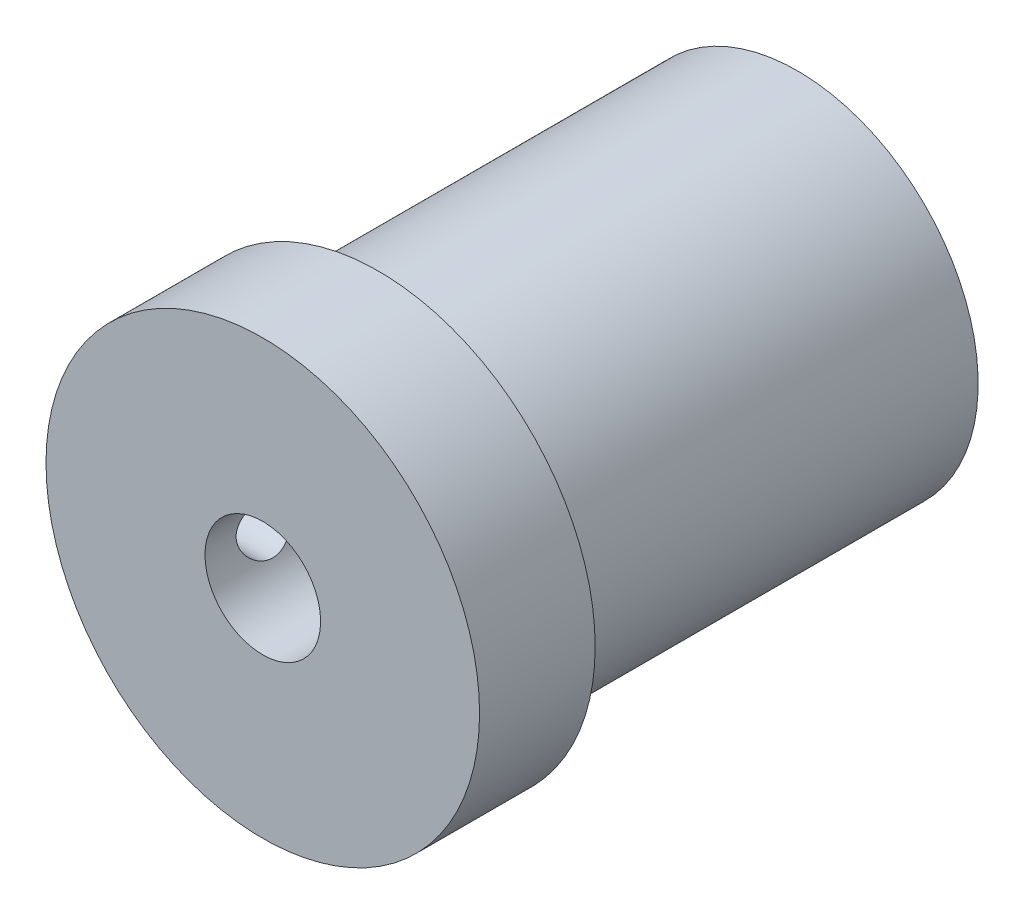
ISO-10303-21;
HEADER;
FILE_DESCRIPTION(('STEP AP214'),'2;1');
FILE_NAME('part.step','',(''),(''),'','','');
FILE_SCHEMA(('AUTOMOTIVE_DESIGN { 1 0 10303 214 1 1 1 1 }'));
ENDSEC;
DATA;
#1=APPLICATION_CONTEXT('core data for automotive mechanical design processes');
#2=APPLICATION_PROTOCOL_DEFINITION('international standard','automotive_design',2000,#1);
#3=PRODUCT_CONTEXT('',#1,'mechanical');
#4=PRODUCT('Part','Part','',(#3));
#5=PRODUCT_RELATED_PRODUCT_CATEGORY('part','',(#4));
#6=PRODUCT_DEFINITION_FORMATION('','',#4);
#7=PRODUCT_DEFINITION_CONTEXT('part definition',#1,'design');
#8=PRODUCT_DEFINITION('design','',#6,#7);
#9=PRODUCT_DEFINITION_SHAPE('','',#8);
#10=(LENGTH_UNIT() NAMED_UNIT(*) SI_UNIT(.MILLI.,.METRE.));
#11=(NAMED_UNIT(*) PLANE_ANGLE_UNIT() SI_UNIT($,.RADIAN.));
#12=(NAMED_UNIT(*) SI_UNIT($,.STERADIAN.) SOLID_ANGLE_UNIT());
#13=UNCERTAINTY_MEASURE_WITH_UNIT(LENGTH_MEASURE(1.E-05),#10,'distance_accuracy_value','');
#14=(GEOMETRIC_REPRESENTATION_CONTEXT(3) GLOBAL_UNCERTAINTY_ASSIGNED_CONTEXT((#13)) GLOBAL_UNIT_ASSIGNED_CONTEXT((#10,
#11,#12)) REPRESENTATION_CONTEXT('',''));
#15=CARTESIAN_POINT('',(0.,0.,0.));
#16=DIRECTION('',(0.,0.,1.));
#17=DIRECTION('',(1.,0.,0.));
#18=AXIS2_PLACEMENT_3D('',#15,#16,#17);
#19=CARTESIAN_POINT('',(0.,0.,0.));
#20=DIRECTION('',(0.,0.,1.));
#21=DIRECTION('',(1.,0.,0.));
#22=AXIS2_PLACEMENT_3D('',#19,#20,#21);
#23=PLANE('',#22);
#24=CARTESIAN_POINT('',(0.,0.,0.));
#25=DIRECTION('',(0.,0.,1.));
#26=DIRECTION('',(1.,0.,0.));
#27=AXIS2_PLACEMENT_3D('',#24,#25,#26);
#28=CIRCLE('',#27,12.5);
#29=CARTESIAN_POINT('',(-12.5,0.,0.));
#30=VERTEX_POINT('',#29);
#31=EDGE_CURVE('E35',#30,#30,#28,.T.);
#32=ORIENTED_EDGE('',*,*,#31,.F.);
#33=EDGE_LOOP('',(#32));
#34=FACE_BOUND('',#33,.T.);
#35=CARTESIAN_POINT('',(0.,0.,0.));
#36=DIRECTION('',(0.,0.,1.));
#37=DIRECTION('',(1.,0.,0.));
#38=AXIS2_PLACEMENT_3D('',#35,#36,#37);
#39=CIRCLE('',#38,4.);
#40=CARTESIAN_POINT('',(4.,0.,0.));
#41=VERTEX_POINT('',#40);
#42=EDGE_CURVE('E42',#41,#41,#39,.T.);
#43=ORIENTED_EDGE('',*,*,#42,.T.);
#44=EDGE_LOOP('',(#43));
#45=FACE_BOUND('',#44,.T.);
#46=ADVANCED_FACE('F31',(#34,#45),#23,.F.);
#47=CARTESIAN_POINT('',(0.,0.,29.));
#48=DIRECTION('',(0.,0.,-1.));
#49=DIRECTION('',(-1.,0.,0.));
#50=AXIS2_PLACEMENT_3D('',#47,#48,#49);
#51=CYLINDRICAL_SURFACE('',#50,12.5);
#52=CARTESIAN_POINT('',(0.,0.,29.));
#53=DIRECTION('',(0.,0.,1.));
#54=DIRECTION('',(1.,0.,0.));
#55=AXIS2_PLACEMENT_3D('',#52,#53,#54);
#56=CIRCLE('',#55,12.5);
#57=CARTESIAN_POINT('',(-12.5,0.,29.));
#58=VERTEX_POINT('',#57);
#59=EDGE_CURVE('E10',#58,#58,#56,.T.);
#60=CARTESIAN_POINT('',(-12.5,0.,29.));
#61=CARTESIAN_POINT('',(-12.5,0.,28.6979166666667));
#62=CARTESIAN_POINT('',(-12.5,0.,28.3958333333333));
#63=CARTESIAN_POINT('',(-12.5,0.,27.7916666666667));
#64=CARTESIAN_POINT('',(-12.5,0.,27.4895833333333));
#65=CARTESIAN_POINT('',(-12.5,0.,26.8854166666667));
#66=CARTESIAN_POINT('',(-12.5,0.,26.5833333333333));
#67=CARTESIAN_POINT('',(-12.5,0.,25.9791666666667));
#68=CARTESIAN_POINT('',(-12.5,0.,25.6770833333333));
#69=CARTESIAN_POINT('',(-12.5,0.,25.0729166666667));
#70=CARTESIAN_POINT('',(-12.5,0.,24.7708333333333));
#71=CARTESIAN_POINT('',(-12.5,0.,24.1666666666667));
#72=CARTESIAN_POINT('',(-12.5,0.,23.8645833333333));
#73=CARTESIAN_POINT('',(-12.5,0.,23.2604166666667));
#74=CARTESIAN_POINT('',(-12.5,0.,22.9583333333333));
#75=CARTESIAN_POINT('',(-12.5,0.,22.3541666666667));
#76=CARTESIAN_POINT('',(-12.5,0.,22.0520833333333));
#77=CARTESIAN_POINT('',(-12.5,0.,21.4479166666667));
#78=CARTESIAN_POINT('',(-12.5,0.,21.1458333333333));
#79=CARTESIAN_POINT('',(-12.5,0.,20.5416666666667));
#80=CARTESIAN_POINT('',(-12.5,0.,20.2395833333333));
#81=CARTESIAN_POINT('',(-12.5,0.,19.6354166666667));
#82=CARTESIAN_POINT('',(-12.5,0.,19.3333333333333));
#83=CARTESIAN_POINT('',(-12.5,0.,18.7291666666667));
#84=CARTESIAN_POINT('',(-12.5,0.,18.4270833333333));
#85=CARTESIAN_POINT('',(-12.5,0.,17.8229166666667));
#86=CARTESIAN_POINT('',(-12.5,0.,17.5208333333333));
#87=CARTESIAN_POINT('',(-12.5,0.,16.9166666666667));
#88=CARTESIAN_POINT('',(-12.5,0.,16.6145833333333));
#89=CARTESIAN_POINT('',(-12.5,0.,16.0104166666667));
#90=CARTESIAN_POINT('',(-12.5,0.,15.7083333333333));
#91=CARTESIAN_POINT('',(-12.5,0.,15.1041666666667));
#92=CARTESIAN_POINT('',(-12.5,0.,14.8020833333333));
#93=CARTESIAN_POINT('',(-12.5,0.,14.1979166666667));
#94=CARTESIAN_POINT('',(-12.5,0.,13.8958333333333));
#95=CARTESIAN_POINT('',(-12.5,0.,13.2916666666667));
#96=CARTESIAN_POINT('',(-12.5,0.,12.9895833333333));
#97=CARTESIAN_POINT('',(-12.5,0.,12.3854166666667));
#98=CARTESIAN_POINT('',(-12.5,0.,12.0833333333333));
#99=CARTESIAN_POINT('',(-12.5,0.,11.4791666666667));
#100=CARTESIAN_POINT('',(-12.5,0.,11.1770833333333));
#101=CARTESIAN_POINT('',(-12.5,0.,10.5729166666667));
#102=CARTESIAN_POINT('',(-12.5,0.,10.2708333333333));
#103=CARTESIAN_POINT('',(-12.5,0.,9.66666666666667));
#104=CARTESIAN_POINT('',(-12.5,0.,9.36458333333333));
#105=CARTESIAN_POINT('',(-12.5,0.,8.76041666666667));
#106=CARTESIAN_POINT('',(-12.5,0.,8.45833333333333));
#107=CARTESIAN_POINT('',(-12.5,0.,7.85416666666667));
#108=CARTESIAN_POINT('',(-12.5,0.,7.55208333333333));
#109=CARTESIAN_POINT('',(-12.5,0.,6.94791666666667));
#110=CARTESIAN_POINT('',(-12.5,0.,6.64583333333333));
#111=CARTESIAN_POINT('',(-12.5,0.,6.04166666666667));
#112=CARTESIAN_POINT('',(-12.5,0.,5.73958333333333));
#113=CARTESIAN_POINT('',(-12.5,0.,5.13541666666667));
#114=CARTESIAN_POINT('',(-12.5,0.,4.83333333333333));
#115=CARTESIAN_POINT('',(-12.5,0.,4.22916666666667));
#116=CARTESIAN_POINT('',(-12.5,0.,3.92708333333333));
#117=CARTESIAN_POINT('',(-12.5,0.,3.32291666666667));
#118=CARTESIAN_POINT('',(-12.5,0.,3.02083333333333));
#119=CARTESIAN_POINT('',(-12.5,0.,2.41666666666667));
#120=CARTESIAN_POINT('',(-12.5,0.,2.11458333333333));
#121=CARTESIAN_POINT('',(-12.5,0.,1.51041666666667));
#122=CARTESIAN_POINT('',(-12.5,0.,1.20833333333333));
#123=CARTESIAN_POINT('',(-12.5,0.,0.604166666666667));
#124=CARTESIAN_POINT('',(-12.5,0.,0.302083333333333));
#125=CARTESIAN_POINT('',(-12.5,0.,0.));
#126=B_SPLINE_CURVE_WITH_KNOTS('',3,(#60,#61,#62,#63,#64,#65,#66,#67,#68,#69,#70,#71,#72,#73,
#74,#75,#76,#77,#78,#79,#80,#81,#82,#83,#84,#85,#86,#87,#88,#89,#90,#91,#92,#93,#94,#95,#96,#97,
#98,#99,#100,#101,#102,#103,#104,#105,#106,#107,#108,#109,#110,#111,#112,#113,#114,#115,#116,
#117,#118,#119,#120,#121,#122,#123,#124,#125),.UNSPECIFIED.,.F.,.F.,(4,2,2,2,2,2,2,2,2,2,2,2,2,
2,2,2,2,2,2,2,2,2,2,2,2,2,2,2,2,2,2,2,4),(0.,0.906250000000001,1.8125,2.71875,3.625,4.53125,
5.4375,6.34375,7.25,8.15625,9.0625,9.96875,10.875,11.78125,12.6875,13.59375,14.5,15.40625,
16.3125,17.21875,18.125,19.03125,19.9375,20.84375,21.75,22.65625,23.5625,24.46875,25.375,
26.28125,27.1875,28.09375,29.),.UNSPECIFIED.);
#127=EDGE_CURVE('BSEAM33',#58,#30,#126,.T.);
#128=ORIENTED_EDGE('',*,*,#59,.F.);
#129=ORIENTED_EDGE('',*,*,#31,.T.);
#130=ORIENTED_EDGE('',*,*,#127,.T.);
#131=ORIENTED_EDGE('',*,*,#127,.F.);
#132=EDGE_LOOP('',(#128,#130,#129,#131));
#133=FACE_BOUND('',#132,.T.);
#134=ADVANCED_FACE('F33',(#133),#51,.T.);
#135=CARTESIAN_POINT('',(0.,0.,29.));
#136=DIRECTION('',(0.,0.,-1.));
#137=DIRECTION('',(-1.,0.,0.));
#138=AXIS2_PLACEMENT_3D('',#135,#136,#137);
#139=CYLINDRICAL_SURFACE('',#138,4.);
#140=CARTESIAN_POINT('',(-4.,0.,34.8466799845355));
#141=CARTESIAN_POINT('',(-3.99999426824049,-0.105158295771673,34.8466105098945));
#142=CARTESIAN_POINT('',(-3.9958086655402,-0.210437070424986,34.8382117285755));
#143=CARTESIAN_POINT('',(-3.9794798367404,-0.417872946005052,34.8051141639921));
#144=CARTESIAN_POINT('',(-3.96732147542728,-0.520023722018191,34.7803843778715));
#145=CARTESIAN_POINT('',(-3.93632190003384,-0.717886423009809,34.7158336147072));
#146=CARTESIAN_POINT('',(-3.91750671691571,-0.81362172496073,34.6760713798896));
#147=CARTESIAN_POINT('',(-3.87492099118611,-0.996922506091609,34.5828873592127));
#148=CARTESIAN_POINT('',(-3.85115084162808,-1.08448863249556,34.5294666567373));
#149=CARTESIAN_POINT('',(-3.79915229954415,-1.2549320951455,34.4068007534011));
#150=CARTESIAN_POINT('',(-3.77074105618663,-1.3372039699278,34.3367929229519));
#151=CARTESIAN_POINT('',(-3.71326423002113,-1.48939555888598,34.1845853492126));
#152=CARTESIAN_POINT('',(-3.68419816724579,-1.55930585668645,34.1023763987027));
#153=CARTESIAN_POINT('',(-3.62611426924905,-1.69021115425573,33.920469634911));
#154=CARTESIAN_POINT('',(-3.59727416414963,-1.75009786056132,33.8199108145098));
#155=CARTESIAN_POINT('',(-3.54597188833075,-1.85185102961401,33.6085516141328));
#156=CARTESIAN_POINT('',(-3.52350513235813,-1.89373045879166,33.4977586734724));
#157=CARTESIAN_POINT('',(-3.48956086636658,-1.95554322619512,33.275880623274));
#158=CARTESIAN_POINT('',(-3.47750333950446,-1.97664571102017,33.1652144305875));
#159=CARTESIAN_POINT('',(-3.46419747280415,-1.99988415681836,32.9413097223944));
#160=CARTESIAN_POINT('',(-3.46293849653203,-2.00203878124405,32.8280738482772));
#161=CARTESIAN_POINT('',(-3.47090099386524,-1.98818403766203,32.6167870396396));
#162=CARTESIAN_POINT('',(-3.4788884549952,-1.9743137651544,32.5185380482776));
#163=CARTESIAN_POINT('',(-3.50228619174838,-1.93250086731372,32.326005665512));
#164=CARTESIAN_POINT('',(-3.5176988339859,-1.90455375516609,32.231723548888));
#165=CARTESIAN_POINT('',(-3.55455696898826,-1.83485771314893,32.047072443376));
#166=CARTESIAN_POINT('',(-3.5761366077536,-1.79279779061802,31.9568488757399));
#167=CARTESIAN_POINT('',(-3.62290050654158,-1.6963087747589,31.7843041832791));
#168=CARTESIAN_POINT('',(-3.64808638732151,-1.64187411333872,31.7019866396107));
#169=CARTESIAN_POINT('',(-3.70308323440834,-1.51413155263125,31.5366014982838));
#170=CARTESIAN_POINT('',(-3.73307569076755,-1.43930566512031,31.454762613712));
#171=CARTESIAN_POINT('',(-3.79171167431493,-1.27686353389597,31.304283666552));
#172=CARTESIAN_POINT('',(-3.82035455455547,-1.18924123682447,31.2356498864639));
#173=CARTESIAN_POINT('',(-3.87467625614099,-0.998570318547271,31.1105573913687));
#174=CARTESIAN_POINT('',(-3.90015740851853,-0.894996558166507,31.0548063154908));
#175=CARTESIAN_POINT('',(-3.94360468190795,-0.678342671091301,30.9619771180286));
#176=CARTESIAN_POINT('',(-3.96157678077822,-0.565270192667733,30.9248841381649));
#177=CARTESIAN_POINT('',(-3.98671451206205,-0.342891756595936,30.8734774747983));
#178=CARTESIAN_POINT('',(-3.99465317902418,-0.234051956880461,30.857528839513));
#179=CARTESIAN_POINT('',(-4.00147020893424,-0.0149676897003205,30.8437405299531));
#180=CARTESIAN_POINT('',(-4.00035284641119,0.0952760905410169,30.8458923121333));
#181=CARTESIAN_POINT('',(-3.98963257771024,0.304974094862117,30.8672955761542));
#182=CARTESIAN_POINT('',(-3.98069261228574,0.404603373344583,30.8852117259258));
#183=CARTESIAN_POINT('',(-3.95607626497057,0.599239139551563,30.9355454410818));
#184=CARTESIAN_POINT('',(-3.94039913674319,0.694245113812226,30.967964613114));
#185=CARTESIAN_POINT('',(-3.90316020063919,0.880107013929766,31.0472441729004));
#186=CARTESIAN_POINT('',(-3.88144180199599,0.970764393997162,31.0944938687561));
#187=CARTESIAN_POINT('',(-3.83421170340287,1.14316346563144,31.2016539240247));
#188=CARTESIAN_POINT('',(-3.80869838449308,1.22490132609334,31.2615696915581));
#189=CARTESIAN_POINT('',(-3.75338158191156,1.38565600245014,31.3991540966288));
#190=CARTESIAN_POINT('',(-3.72340286570497,1.46361659815135,31.4779885374309));
#191=CARTESIAN_POINT('',(-3.6643869270289,1.60567680920496,31.6476901839153));
#192=CARTESIAN_POINT('',(-3.63535036583859,1.6697668606643,31.7385656228305));
#193=CARTESIAN_POINT('',(-3.58014868890496,1.78516919604488,31.9353037103355));
#194=CARTESIAN_POINT('',(-3.55418924631752,1.83571732822876,32.0416774088444));
#195=CARTESIAN_POINT('',(-3.51066803845626,1.9176533512624,32.2631376425059));
#196=CARTESIAN_POINT('',(-3.49309543170531,1.94906599274217,32.3782127053325));
#197=CARTESIAN_POINT('',(-3.47053272202686,1.98893950494492,32.6019603894021));
#198=CARTESIAN_POINT('',(-3.46449442902712,1.99931832389651,32.7101833237724));
#199=CARTESIAN_POINT('',(-3.46274110746501,2.00235730206005,32.9269420364604));
#200=CARTESIAN_POINT('',(-3.46702164743934,1.99502506735074,33.0354776604973));
#201=CARTESIAN_POINT('',(-3.48431250534687,1.96464180433155,33.2389099250204));
#202=CARTESIAN_POINT('',(-3.49645478804286,1.94315036834406,33.3341226804487));
#203=CARTESIAN_POINT('',(-3.52708409831365,1.88698037466605,33.5194873453682));
#204=CARTESIAN_POINT('',(-3.54557316588523,1.85229757659298,33.609637616811));
#205=CARTESIAN_POINT('',(-3.58833706491003,1.76810751894553,33.7890521982319));
#206=CARTESIAN_POINT('',(-3.61291819740356,1.71775762310946,33.8778459475541));
#207=CARTESIAN_POINT('',(-3.66457931400132,1.60459545414773,34.0463042061421));
#208=CARTESIAN_POINT('',(-3.69166059639049,1.54177668645854,34.1259639235782));
#209=CARTESIAN_POINT('',(-3.749207515043,1.39651526306699,34.283949254258));
#210=CARTESIAN_POINT('',(-3.77968486257809,1.31261605164159,34.3609387142681));
#211=CARTESIAN_POINT('',(-3.83757815371479,1.13223653173192,34.5000433534774));
#212=CARTESIAN_POINT('',(-3.86499245175155,1.03574952045094,34.5621505577808));
#213=CARTESIAN_POINT('',(-3.91400577375822,0.831651631881852,34.6697823361625));
#214=CARTESIAN_POINT('',(-3.9355643060907,0.723970081402262,34.7151921773752));
#215=CARTESIAN_POINT('',(-3.97005850681873,0.501235371599251,34.7866665608365));
#216=CARTESIAN_POINT('',(-3.98301867222959,0.386204187113268,34.8127860860721));
#217=CARTESIAN_POINT('',(-3.99392050460483,0.224996310875785,34.8346324883558));
#218=CARTESIAN_POINT('',(-3.99619441156354,0.180155966221748,34.839167493836));
#219=CARTESIAN_POINT('',(-3.99923540926975,0.0902178123337585,34.8452061875225));
#220=CARTESIAN_POINT('',(-4.00000245931113,0.045119996177494,34.8467097938388));
#221=CARTESIAN_POINT('',(-4.,0.,34.8466799845355));
#222=B_SPLINE_CURVE_WITH_KNOTS('',3,(#140,#141,#142,#143,#144,#145,#146,#147,#148,#149,#150,
#151,#152,#153,#154,#155,#156,#157,#158,#159,#160,#161,#162,#163,#164,#165,#166,#167,#168,#169,
#170,#171,#172,#173,#174,#175,#176,#177,#178,#179,#180,#181,#182,#183,#184,#185,#186,#187,#188,
#189,#190,#191,#192,#193,#194,#195,#196,#197,#198,#199,#200,#201,#202,#203,#204,#205,#206,#207,
#208,#209,#210,#211,#212,#213,#214,#215,#216,#217,#218,#219,#220,#221),.UNSPECIFIED.,.T.,.F.,(4,
2,2,2,2,2,2,2,2,2,2,2,2,2,2,2,2,2,2,2,2,2,2,2,2,2,2,2,2,2,2,2,2,2,2,2,2,2,2,2,4),(0.,
0.315291833737225,0.631183946297492,0.945854198360628,1.26049949865198,1.59420708979003,
1.92816779623023,2.28796747644078,2.64750764144119,2.98540849416756,3.32297648061726,
3.62021911287962,3.91755654748065,4.22193104261234,4.5264427650013,4.86957109313883,
5.21286226753166,5.571988578601,5.93082844669918,6.25988884295186,6.58879392872599,
6.89226205241607,7.19576380269506,7.50801342411514,7.82039663918599,8.16346912490204,
8.50677741450902,8.86662169412385,9.22599954258402,9.55079048386353,9.8754419672496,
10.1692490266986,10.4631506107854,10.7768908012712,11.0907948380126,11.4428094248052,
11.7950122245329,12.1495917937633,12.5031567662908,12.6384345581672,12.7737160043777),.UNSPECIFIED.);
#223=CARTESIAN_POINT('',(-4.,0.,34.8466799845355));
#224=VERTEX_POINT('',#223);
#225=EDGE_CURVE('E62',#224,#224,#222,.T.);
#226=ORIENTED_EDGE('',*,*,#225,.F.);
#227=EDGE_LOOP('',(#226));
#228=FACE_BOUND('',#227,.T.);
#229=ORIENTED_EDGE('',*,*,#42,.F.);
#230=EDGE_LOOP('',(#229));
#231=FACE_BOUND('',#230,.T.);
#232=CARTESIAN_POINT('',(0.,0.,37.));
#233=DIRECTION('',(0.,0.,-1.));
#234=DIRECTION('',(-1.,0.,0.));
#235=AXIS2_PLACEMENT_3D('',#232,#233,#234);
#236=CIRCLE('',#235,4.);
#237=CARTESIAN_POINT('',(-4.,0.,37.));
#238=VERTEX_POINT('',#237);
#239=EDGE_CURVE('E50',#238,#238,#236,.T.);
#240=ORIENTED_EDGE('',*,*,#239,.F.);
#241=EDGE_LOOP('',(#240));
#242=FACE_BOUND('',#241,.T.);
#243=ADVANCED_FACE('F82',(#228,#231,#242),#139,.F.);
#244=CARTESIAN_POINT('',(0.,0.,29.));
#245=DIRECTION('',(0.,0.,1.));
#246=DIRECTION('',(1.,0.,0.));
#247=AXIS2_PLACEMENT_3D('',#244,#245,#246);
#248=PLANE('',#247);
#249=CARTESIAN_POINT('',(0.,0.,29.));
#250=DIRECTION('',(0.,0.,1.));
#251=DIRECTION('',(1.,0.,0.));
#252=AXIS2_PLACEMENT_3D('',#249,#250,#251);
#253=CIRCLE('',#252,15.);
#254=CARTESIAN_POINT('',(15.,0.,29.));
#255=VERTEX_POINT('',#254);
#256=EDGE_CURVE('E47',#255,#255,#253,.T.);
#257=ORIENTED_EDGE('',*,*,#256,.F.);
#258=EDGE_LOOP('',(#257));
#259=FACE_BOUND('',#258,.T.);
#260=ORIENTED_EDGE('',*,*,#59,.T.);
#261=EDGE_LOOP('',(#260));
#262=FACE_BOUND('',#261,.T.);
#263=ADVANCED_FACE('F80',(#259,#262),#248,.F.);
#264=CARTESIAN_POINT('',(0.,0.,37.));
#265=DIRECTION('',(0.,0.,-1.));
#266=DIRECTION('',(-1.,0.,0.));
#267=AXIS2_PLACEMENT_3D('',#264,#265,#266);
#268=CYLINDRICAL_SURFACE('',#267,15.);
#269=CARTESIAN_POINT('',(-15.,0.,34.8466753154772));
#270=CARTESIAN_POINT('',(-14.9999983584599,-0.111813342505654,34.8464199204797));
#271=CARTESIAN_POINT('',(-14.998736608301,-0.22367394741684,34.8367654703068));
#272=CARTESIAN_POINT('',(-14.9938274131874,-0.444235840972029,34.7989092086859));
#273=CARTESIAN_POINT('',(-14.9901775277573,-0.552933778821157,34.7706884238272));
#274=CARTESIAN_POINT('',(-14.9809056508485,-0.763946285060985,34.6965495994964));
#275=CARTESIAN_POINT('',(-14.9752850413361,-0.866265267614448,34.6506439592725));
#276=CARTESIAN_POINT('',(-14.9626981092495,-1.06172977156183,34.5424662280224));
#277=CARTESIAN_POINT('',(-14.9557320039585,-1.15487677047183,34.4801967789932));
#278=CARTESIAN_POINT('',(-14.9411846195964,-1.32995255680852,34.3406436949163));
#279=CARTESIAN_POINT('',(-14.9336001265782,-1.41181588793575,34.2632782681353));
#280=CARTESIAN_POINT('',(-14.918699003324,-1.56143766194071,34.0959067064112));
#281=CARTESIAN_POINT('',(-14.911382387176,-1.6291953638647,34.0058999078459));
#282=CARTESIAN_POINT('',(-14.8978161084269,-1.74892322580689,33.8153781709933));
#283=CARTESIAN_POINT('',(-14.891570592467,-1.8008326098516,33.7148247190659));
#284=CARTESIAN_POINT('',(-14.8808978137799,-1.88700212274366,33.5063298430159));
#285=CARTESIAN_POINT('',(-14.8764704721221,-1.92126301776384,33.3983887398436));
#286=CARTESIAN_POINT('',(-14.8699674693724,-1.97096381740403,33.1788681903531));
#287=CARTESIAN_POINT('',(-14.8678778830989,-1.98651521019636,33.067314405217));
#288=CARTESIAN_POINT('',(-14.8662449704976,-1.99869973456172,32.8431624779878));
#289=CARTESIAN_POINT('',(-14.8667015289497,-1.99533372219956,32.7305643833829));
#290=CARTESIAN_POINT('',(-14.8700963872066,-1.96987116090502,32.5082881109993));
#291=CARTESIAN_POINT('',(-14.873018612115,-1.94789593128245,32.3985957554528));
#292=CARTESIAN_POINT('',(-14.8809901182448,-1.8860269282718,32.1844691030967));
#293=CARTESIAN_POINT('',(-14.8860394488665,-1.84613273872972,32.080034928467));
#294=CARTESIAN_POINT('',(-14.8977140241678,-1.74942410346296,31.8790050163656));
#295=CARTESIAN_POINT('',(-14.9043442598414,-1.69255592387507,31.7824354300532));
#296=CARTESIAN_POINT('',(-14.9184281874941,-1.56355272949736,31.6001630901335));
#297=CARTESIAN_POINT('',(-14.9258819222215,-1.49141692198002,31.514460901154));
#298=CARTESIAN_POINT('',(-14.9408429427215,-1.33325049136759,31.355650242425));
#299=CARTESIAN_POINT('',(-14.9483501886093,-1.24711504996784,31.2826461212293));
#300=CARTESIAN_POINT('',(-14.9625152328773,-1.06375702410932,31.1521157175043));
#301=CARTESIAN_POINT('',(-14.9691730292409,-0.966534413331845,31.0945894717173));
#302=CARTESIAN_POINT('',(-14.9808910137057,-0.76368632874217,30.9966503179227));
#303=CARTESIAN_POINT('',(-14.9859506625527,-0.658058033664515,30.9562431847584));
#304=CARTESIAN_POINT('',(-14.9938945511916,-0.441433195377271,30.893768471748));
#305=CARTESIAN_POINT('',(-14.996778907206,-0.330436939306334,30.8716999120954));
#306=CARTESIAN_POINT('',(-15.0000298433071,-0.107130813530998,30.846662976044));
#307=CARTESIAN_POINT('',(-15.00041539922,0.00516265267467741,30.8435506573381));
#308=CARTESIAN_POINT('',(-14.9986733041348,0.228668415172488,30.85613547129));
#309=CARTESIAN_POINT('',(-14.9965457131472,0.339880737216945,30.8718321548144));
#310=CARTESIAN_POINT('',(-14.9900253182055,0.557648028350718,30.9214704845029));
#311=CARTESIAN_POINT('',(-14.9856409259539,0.66421870931413,30.955344399051));
#312=CARTESIAN_POINT('',(-14.9750943812174,0.870167114695834,31.0403055519086));
#313=CARTESIAN_POINT('',(-14.9689321603503,0.969544562250369,31.0913934523478));
#314=CARTESIAN_POINT('',(-14.9554660100381,1.15892779969554,31.2096809794745));
#315=CARTESIAN_POINT('',(-14.9481555837199,1.24887508103149,31.2769735286444));
#316=CARTESIAN_POINT('',(-14.9332283879948,1.41625004589756,31.4256278469501));
#317=CARTESIAN_POINT('',(-14.925611604771,1.49367716396275,31.5069902511984));
#318=CARTESIAN_POINT('',(-14.9108697038386,1.63432275809401,31.6821068835921));
#319=CARTESIAN_POINT('',(-14.9037480830052,1.69744614158195,31.7759378224082));
#320=CARTESIAN_POINT('',(-14.8908589121686,1.80703584816315,31.9729554927536));
#321=CARTESIAN_POINT('',(-14.8850913312581,1.85350255147353,32.0761420106585));
#322=CARTESIAN_POINT('',(-14.8755862368868,1.92830530156394,32.2886327641857));
#323=CARTESIAN_POINT('',(-14.8718426849112,1.95669532408755,32.3979177172312));
#324=CARTESIAN_POINT('',(-14.8667916937546,1.99471269317348,32.61975699093));
#325=CARTESIAN_POINT('',(-14.8654841245602,2.00434104108611,32.7323111367741));
#326=CARTESIAN_POINT('',(-14.8654566462604,2.00454420319157,32.9565445370226));
#327=CARTESIAN_POINT('',(-14.8667163886449,1.99526884809765,33.0682236829265));
#328=CARTESIAN_POINT('',(-14.871638149984,1.95824469767708,33.2884199549545));
#329=CARTESIAN_POINT('',(-14.8753001691892,1.93049590042392,33.3969370807487));
#330=CARTESIAN_POINT('',(-14.8846083875134,1.85735873048189,33.6077108292628));
#331=CARTESIAN_POINT('',(-14.8902538027269,1.8119773260489,33.7099699066543));
#332=CARTESIAN_POINT('',(-14.9028952932635,1.70487737118987,33.9054463824584));
#333=CARTESIAN_POINT('',(-14.9098913948467,1.64315850312411,33.9986636050274));
#334=CARTESIAN_POINT('',(-14.9245140974375,1.50457861995002,34.174176629656));
#335=CARTESIAN_POINT('',(-14.9321450957466,1.42760582920239,34.2563838186179));
#336=CARTESIAN_POINT('',(-14.9471407382189,1.26093988278022,34.4067698201952));
#337=CARTESIAN_POINT('',(-14.9545053195892,1.17124375248569,34.4749453431527));
#338=CARTESIAN_POINT('',(-14.9681756542766,0.981234688444698,34.5955834296096));
#339=CARTESIAN_POINT('',(-14.9744767670624,0.880878187616065,34.6479778728065));
#340=CARTESIAN_POINT('',(-14.9852663890557,0.672759517066835,34.73509260786));
#341=CARTESIAN_POINT('',(-14.9897568388539,0.565005421549079,34.7698318322777));
#342=CARTESIAN_POINT('',(-14.9953571893893,0.380594614558965,34.8124895491262));
#343=CARTESIAN_POINT('',(-14.9970898479651,0.305082010737376,34.8254406762799));
#344=CARTESIAN_POINT('',(-14.9994118100481,0.153053647130786,34.8426209317565));
#345=CARTESIAN_POINT('',(-15.0000011236586,0.0765378962162867,34.846850137152));
#346=CARTESIAN_POINT('',(-15.,0.,34.8466753154772));
#347=B_SPLINE_CURVE_WITH_KNOTS('',3,(#269,#270,#271,#272,#273,#274,#275,#276,#277,#278,#279,
#280,#281,#282,#283,#284,#285,#286,#287,#288,#289,#290,#291,#292,#293,#294,#295,#296,#297,#298,
#299,#300,#301,#302,#303,#304,#305,#306,#307,#308,#309,#310,#311,#312,#313,#314,#315,#316,#317,
#318,#319,#320,#321,#322,#323,#324,#325,#326,#327,#328,#329,#330,#331,#332,#333,#334,#335,#336,
#337,#338,#339,#340,#341,#342,#343,#344,#345,#346),.UNSPECIFIED.,.T.,.F.,(4,2,2,2,2,2,2,2,2,2,2,
2,2,2,2,2,2,2,2,2,2,2,2,2,2,2,2,2,2,2,2,2,2,2,2,2,2,2,4),(0.,0.335161279901777,
0.670665602798802,1.00593512295165,1.34115054583164,1.67823533356565,2.01533782354028,
2.35371726836159,2.69208202189764,3.0284203432061,3.36474344439981,3.69889068141818,
4.033045679149,4.36826992394556,4.7035115785655,5.04138985029407,5.37926892409404,
5.71726188511045,6.05523678643349,6.39064207718337,6.72603935907203,7.06019548165285,
7.39436445889494,7.73049731272392,8.06664534353419,8.40496651713629,8.74327996748878,
9.08057844007445,9.41785890983289,9.75247649301483,10.0870941110924,10.4215796254239,
10.7560716434391,11.0931119288421,11.4302311419705,11.7687853630456,12.106975765632,
12.3364006747546,12.5658235565144),.UNSPECIFIED.);
#348=CARTESIAN_POINT('',(-15.,0.,34.8466753154772));
#349=VERTEX_POINT('',#348);
#350=EDGE_CURVE('E55',#349,#349,#347,.T.);
#351=ORIENTED_EDGE('',*,*,#350,.T.);
#352=EDGE_LOOP('',(#351));
#353=FACE_BOUND('',#352,.T.);
#354=CARTESIAN_POINT('',(0.,0.,37.));
#355=DIRECTION('',(0.,0.,1.));
#356=DIRECTION('',(1.,0.,0.));
#357=AXIS2_PLACEMENT_3D('',#354,#355,#356);
#358=CIRCLE('',#357,15.);
#359=CARTESIAN_POINT('',(15.,0.,37.));
#360=VERTEX_POINT('',#359);
#361=EDGE_CURVE('E46',#360,#360,#358,.T.);
#362=ORIENTED_EDGE('',*,*,#361,.F.);
#363=EDGE_LOOP('',(#362));
#364=FACE_BOUND('',#363,.T.);
#365=ORIENTED_EDGE('',*,*,#256,.T.);
#366=EDGE_LOOP('',(#365));
#367=FACE_BOUND('',#366,.T.);
#368=ADVANCED_FACE('F66',(#353,#364,#367),#268,.T.);
#369=CARTESIAN_POINT('',(0.,0.,37.));
#370=DIRECTION('',(0.,0.,1.));
#371=DIRECTION('',(1.,0.,0.));
#372=AXIS2_PLACEMENT_3D('',#369,#370,#371);
#373=PLANE('',#372);
#374=ORIENTED_EDGE('',*,*,#239,.T.);
#375=EDGE_LOOP('',(#374));
#376=FACE_BOUND('',#375,.T.);
#377=ORIENTED_EDGE('',*,*,#361,.T.);
#378=EDGE_LOOP('',(#377));
#379=FACE_BOUND('',#378,.T.);
#380=ADVANCED_FACE('F73',(#376,#379),#373,.T.);
#381=CARTESIAN_POINT('',(-14.9999993298011,0.00448396764330252,32.8466803419749));
#382=DIRECTION('',(-0.999999955320075,0.000298931176220168,0.));
#383=DIRECTION('',(-0.000298931176220168,-0.999999955320075,0.));
#384=AXIS2_PLACEMENT_3D('',#381,#382,#383);
#385=CYLINDRICAL_SURFACE('',#384,1.99999999999999);
#386=ORIENTED_EDGE('',*,*,#225,.T.);
#387=EDGE_LOOP('',(#386));
#388=FACE_BOUND('',#387,.T.);
#389=ORIENTED_EDGE('',*,*,#350,.F.);
#390=EDGE_LOOP('',(#389));
#391=FACE_BOUND('',#390,.T.);
#392=ADVANCED_FACE('F70',(#388,#391),#385,.F.);
#393=CLOSED_SHELL('',(#46,#134,#243,#263,#368,#380,#392));
#394=MANIFOLD_SOLID_BREP('B2',#393);
#395=ADVANCED_BREP_SHAPE_REPRESENTATION('',(#18,#394),#14);
#396=SHAPE_DEFINITION_REPRESENTATION(#9,#395);
ENDSEC;
END-ISO-10303-21;
